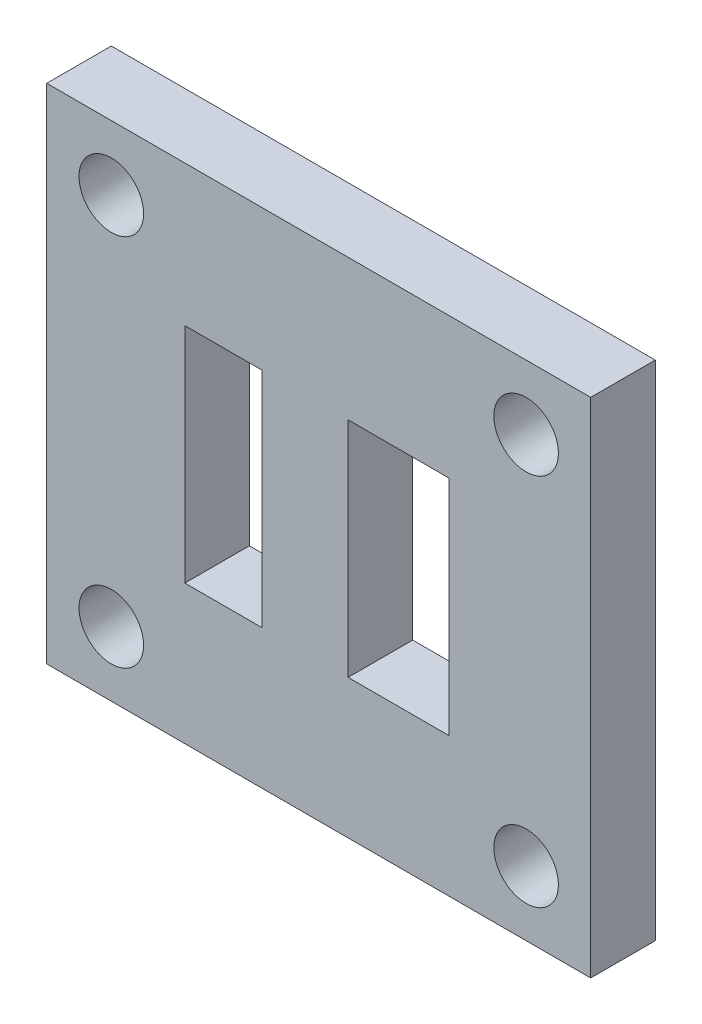
ISO-10303-21;
HEADER;
FILE_DESCRIPTION(('STEP AP214'),'2;1');
FILE_NAME('part.step','',(''),(''),'','','');
FILE_SCHEMA(('AUTOMOTIVE_DESIGN { 1 0 10303 214 1 1 1 1 }'));
ENDSEC;
DATA;
#1=APPLICATION_CONTEXT('core data for automotive mechanical design processes');
#2=APPLICATION_PROTOCOL_DEFINITION('international standard','automotive_design',2000,#1);
#3=PRODUCT_CONTEXT('',#1,'mechanical');
#4=PRODUCT('Part','Part','',(#3));
#5=PRODUCT_RELATED_PRODUCT_CATEGORY('part','',(#4));
#6=PRODUCT_DEFINITION_FORMATION('','',#4);
#7=PRODUCT_DEFINITION_CONTEXT('part definition',#1,'design');
#8=PRODUCT_DEFINITION('design','',#6,#7);
#9=PRODUCT_DEFINITION_SHAPE('','',#8);
#10=(LENGTH_UNIT() NAMED_UNIT(*) SI_UNIT(.MILLI.,.METRE.));
#11=(NAMED_UNIT(*) PLANE_ANGLE_UNIT() SI_UNIT($,.RADIAN.));
#12=(NAMED_UNIT(*) SI_UNIT($,.STERADIAN.) SOLID_ANGLE_UNIT());
#13=UNCERTAINTY_MEASURE_WITH_UNIT(LENGTH_MEASURE(1.E-05),#10,'distance_accuracy_value','');
#14=(GEOMETRIC_REPRESENTATION_CONTEXT(3) GLOBAL_UNCERTAINTY_ASSIGNED_CONTEXT((#13)) GLOBAL_UNIT_ASSIGNED_CONTEXT((#10,
#11,#12)) REPRESENTATION_CONTEXT('',''));
#15=CARTESIAN_POINT('',(0.,0.,0.));
#16=DIRECTION('',(0.,0.,1.));
#17=DIRECTION('',(1.,0.,0.));
#18=AXIS2_PLACEMENT_3D('',#15,#16,#17);
#19=CARTESIAN_POINT('',(12.635,0.,3.));
#20=DIRECTION('',(1.,0.,0.));
#21=DIRECTION('',(0.,1.,0.));
#22=AXIS2_PLACEMENT_3D('',#19,#20,#21);
#23=PLANE('',#22);
#24=DIRECTION('',(0.,-1.,0.));
#25=VECTOR('',#24,1.);
#26=CARTESIAN_POINT('',(12.635,0.,0.));
#27=LINE('',#26,#25);
#28=CARTESIAN_POINT('',(12.635,11.68,0.));
#29=VERTEX_POINT('',#28);
#30=CARTESIAN_POINT('',(12.635,-11.68,0.));
#31=VERTEX_POINT('',#30);
#32=EDGE_CURVE('E216',#29,#31,#27,.T.);
#33=ORIENTED_EDGE('',*,*,#32,.F.);
#34=DIRECTION('',(0.,0.,-1.));
#35=VECTOR('',#34,1.);
#36=CARTESIAN_POINT('',(12.635,11.68,3.));
#37=LINE('',#36,#35);
#38=CARTESIAN_POINT('',(12.635,11.68,3.));
#39=VERTEX_POINT('',#38);
#40=EDGE_CURVE('E11',#39,#29,#37,.T.);
#41=ORIENTED_EDGE('',*,*,#40,.F.);
#42=DIRECTION('',(0.,-1.,0.));
#43=VECTOR('',#42,1.);
#44=CARTESIAN_POINT('',(12.635,0.,3.));
#45=LINE('',#44,#43);
#46=CARTESIAN_POINT('',(12.635,-11.68,3.));
#47=VERTEX_POINT('',#46);
#48=EDGE_CURVE('E164',#39,#47,#45,.T.);
#49=ORIENTED_EDGE('',*,*,#48,.T.);
#50=DIRECTION('',(0.,0.,-1.));
#51=VECTOR('',#50,1.);
#52=CARTESIAN_POINT('',(12.635,-11.68,3.));
#53=LINE('',#52,#51);
#54=EDGE_CURVE('E112',#47,#31,#53,.T.);
#55=ORIENTED_EDGE('',*,*,#54,.T.);
#56=EDGE_LOOP('',(#33,#41,#49,#55));
#57=FACE_BOUND('',#56,.T.);
#58=ADVANCED_FACE('F45',(#57),#23,.T.);
#59=CARTESIAN_POINT('',(0.,11.68,3.));
#60=DIRECTION('',(0.,1.,0.));
#61=DIRECTION('',(0.,0.,1.));
#62=AXIS2_PLACEMENT_3D('',#59,#60,#61);
#63=PLANE('',#62);
#64=DIRECTION('',(1.,0.,0.));
#65=VECTOR('',#64,1.);
#66=CARTESIAN_POINT('',(0.,11.68,0.));
#67=LINE('',#66,#65);
#68=CARTESIAN_POINT('',(-12.635,11.68,0.));
#69=VERTEX_POINT('',#68);
#70=EDGE_CURVE('E152',#69,#29,#67,.T.);
#71=ORIENTED_EDGE('',*,*,#70,.F.);
#72=DIRECTION('',(0.,0.,-1.));
#73=VECTOR('',#72,1.);
#74=CARTESIAN_POINT('',(-12.635,11.68,3.));
#75=LINE('',#74,#73);
#76=CARTESIAN_POINT('',(-12.635,11.68,3.));
#77=VERTEX_POINT('',#76);
#78=EDGE_CURVE('E56',#77,#69,#75,.T.);
#79=ORIENTED_EDGE('',*,*,#78,.F.);
#80=DIRECTION('',(1.,0.,0.));
#81=VECTOR('',#80,1.);
#82=CARTESIAN_POINT('',(0.,11.68,3.));
#83=LINE('',#82,#81);
#84=EDGE_CURVE('E150',#77,#39,#83,.T.);
#85=ORIENTED_EDGE('',*,*,#84,.T.);
#86=ORIENTED_EDGE('',*,*,#40,.T.);
#87=EDGE_LOOP('',(#71,#79,#85,#86));
#88=FACE_BOUND('',#87,.T.);
#89=ADVANCED_FACE('F148',(#88),#63,.T.);
#90=CARTESIAN_POINT('',(-12.635,0.,3.));
#91=DIRECTION('',(1.,0.,0.));
#92=DIRECTION('',(0.,1.,0.));
#93=AXIS2_PLACEMENT_3D('',#90,#91,#92);
#94=PLANE('',#93);
#95=DIRECTION('',(0.,-1.,0.));
#96=VECTOR('',#95,1.);
#97=CARTESIAN_POINT('',(-12.635,0.,0.));
#98=LINE('',#97,#96);
#99=CARTESIAN_POINT('',(-12.635,-11.68,0.));
#100=VERTEX_POINT('',#99);
#101=EDGE_CURVE('E221',#69,#100,#98,.T.);
#102=ORIENTED_EDGE('',*,*,#101,.T.);
#103=DIRECTION('',(0.,0.,-1.));
#104=VECTOR('',#103,1.);
#105=CARTESIAN_POINT('',(-12.635,-11.68,3.));
#106=LINE('',#105,#104);
#107=CARTESIAN_POINT('',(-12.635,-11.68,3.));
#108=VERTEX_POINT('',#107);
#109=EDGE_CURVE('E156',#108,#100,#106,.T.);
#110=ORIENTED_EDGE('',*,*,#109,.F.);
#111=DIRECTION('',(0.,-1.,0.));
#112=VECTOR('',#111,1.);
#113=CARTESIAN_POINT('',(-12.635,0.,3.));
#114=LINE('',#113,#112);
#115=EDGE_CURVE('E159',#77,#108,#114,.T.);
#116=ORIENTED_EDGE('',*,*,#115,.F.);
#117=ORIENTED_EDGE('',*,*,#78,.T.);
#118=EDGE_LOOP('',(#102,#110,#116,#117));
#119=FACE_BOUND('',#118,.T.);
#120=ADVANCED_FACE('F160',(#119),#94,.F.);
#121=CARTESIAN_POINT('',(0.,5.14,3.));
#122=DIRECTION('',(0.,1.,0.));
#123=DIRECTION('',(0.,0.,1.));
#124=AXIS2_PLACEMENT_3D('',#121,#122,#123);
#125=PLANE('',#124);
#126=DIRECTION('',(1.,0.,0.));
#127=VECTOR('',#126,1.);
#128=CARTESIAN_POINT('',(0.,5.14,0.));
#129=LINE('',#128,#127);
#130=CARTESIAN_POINT('',(-6.22,5.14,0.));
#131=VERTEX_POINT('',#130);
#132=CARTESIAN_POINT('',(-2.635,5.14,0.));
#133=VERTEX_POINT('',#132);
#134=EDGE_CURVE('E183',#131,#133,#129,.T.);
#135=ORIENTED_EDGE('',*,*,#134,.T.);
#136=DIRECTION('',(0.,0.,-1.));
#137=VECTOR('',#136,1.);
#138=CARTESIAN_POINT('',(-2.635,5.14,3.));
#139=LINE('',#138,#137);
#140=CARTESIAN_POINT('',(-2.635,5.14,3.));
#141=VERTEX_POINT('',#140);
#142=EDGE_CURVE('E229',#141,#133,#139,.T.);
#143=ORIENTED_EDGE('',*,*,#142,.F.);
#144=DIRECTION('',(1.,0.,0.));
#145=VECTOR('',#144,1.);
#146=CARTESIAN_POINT('',(0.,5.14,3.));
#147=LINE('',#146,#145);
#148=CARTESIAN_POINT('',(-6.22,5.14,3.));
#149=VERTEX_POINT('',#148);
#150=EDGE_CURVE('E332',#149,#141,#147,.T.);
#151=ORIENTED_EDGE('',*,*,#150,.F.);
#152=DIRECTION('',(0.,0.,-1.));
#153=VECTOR('',#152,1.);
#154=CARTESIAN_POINT('',(-6.22,5.14,3.));
#155=LINE('',#154,#153);
#156=EDGE_CURVE('E232',#149,#131,#155,.T.);
#157=ORIENTED_EDGE('',*,*,#156,.T.);
#158=EDGE_LOOP('',(#135,#143,#151,#157));
#159=FACE_BOUND('',#158,.T.);
#160=ADVANCED_FACE('F282',(#159),#125,.F.);
#161=CARTESIAN_POINT('',(-2.635,0.,3.));
#162=DIRECTION('',(1.,0.,0.));
#163=DIRECTION('',(0.,1.,0.));
#164=AXIS2_PLACEMENT_3D('',#161,#162,#163);
#165=PLANE('',#164);
#166=DIRECTION('',(0.,-1.,0.));
#167=VECTOR('',#166,1.);
#168=CARTESIAN_POINT('',(-2.635,0.,0.));
#169=LINE('',#168,#167);
#170=CARTESIAN_POINT('',(-2.635,-5.22,0.));
#171=VERTEX_POINT('',#170);
#172=EDGE_CURVE('E192',#133,#171,#169,.T.);
#173=ORIENTED_EDGE('',*,*,#172,.T.);
#174=DIRECTION('',(0.,0.,-1.));
#175=VECTOR('',#174,1.);
#176=CARTESIAN_POINT('',(-2.635,-5.22,3.));
#177=LINE('',#176,#175);
#178=CARTESIAN_POINT('',(-2.635,-5.22,3.));
#179=VERTEX_POINT('',#178);
#180=EDGE_CURVE('E238',#179,#171,#177,.T.);
#181=ORIENTED_EDGE('',*,*,#180,.F.);
#182=DIRECTION('',(0.,-1.,0.));
#183=VECTOR('',#182,1.);
#184=CARTESIAN_POINT('',(-2.635,0.,3.));
#185=LINE('',#184,#183);
#186=EDGE_CURVE('E340',#141,#179,#185,.T.);
#187=ORIENTED_EDGE('',*,*,#186,.F.);
#188=ORIENTED_EDGE('',*,*,#142,.T.);
#189=EDGE_LOOP('',(#173,#181,#187,#188));
#190=FACE_BOUND('',#189,.T.);
#191=ADVANCED_FACE('F309',(#190),#165,.F.);
#192=CARTESIAN_POINT('',(0.,-5.22,3.));
#193=DIRECTION('',(0.,1.,0.));
#194=DIRECTION('',(-1.,0.,0.));
#195=AXIS2_PLACEMENT_3D('',#192,#193,#194);
#196=PLANE('',#195);
#197=DIRECTION('',(1.,0.,0.));
#198=VECTOR('',#197,1.);
#199=CARTESIAN_POINT('',(0.,-5.22,0.));
#200=LINE('',#199,#198);
#201=CARTESIAN_POINT('',(-6.22,-5.22,0.));
#202=VERTEX_POINT('',#201);
#203=EDGE_CURVE('E191',#202,#171,#200,.T.);
#204=ORIENTED_EDGE('',*,*,#203,.F.);
#205=DIRECTION('',(0.,0.,-1.));
#206=VECTOR('',#205,1.);
#207=CARTESIAN_POINT('',(-6.22,-5.22,3.));
#208=LINE('',#207,#206);
#209=CARTESIAN_POINT('',(-6.22,-5.22,3.));
#210=VERTEX_POINT('',#209);
#211=EDGE_CURVE('E235',#210,#202,#208,.T.);
#212=ORIENTED_EDGE('',*,*,#211,.F.);
#213=DIRECTION('',(1.,0.,0.));
#214=VECTOR('',#213,1.);
#215=CARTESIAN_POINT('',(0.,-5.22,3.));
#216=LINE('',#215,#214);
#217=EDGE_CURVE('E337',#210,#179,#216,.T.);
#218=ORIENTED_EDGE('',*,*,#217,.T.);
#219=ORIENTED_EDGE('',*,*,#180,.T.);
#220=EDGE_LOOP('',(#204,#212,#218,#219));
#221=FACE_BOUND('',#220,.T.);
#222=ADVANCED_FACE('F306',(#221),#196,.T.);
#223=CARTESIAN_POINT('',(1.365,0.,3.));
#224=DIRECTION('',(1.,0.,0.));
#225=DIRECTION('',(0.,1.,0.));
#226=AXIS2_PLACEMENT_3D('',#223,#224,#225);
#227=PLANE('',#226);
#228=DIRECTION('',(0.,-1.,0.));
#229=VECTOR('',#228,1.);
#230=CARTESIAN_POINT('',(1.365,0.,0.));
#231=LINE('',#230,#229);
#232=CARTESIAN_POINT('',(1.365,5.14,0.));
#233=VERTEX_POINT('',#232);
#234=CARTESIAN_POINT('',(1.365,-5.22,0.));
#235=VERTEX_POINT('',#234);
#236=EDGE_CURVE('E175',#233,#235,#231,.T.);
#237=ORIENTED_EDGE('',*,*,#236,.F.);
#238=DIRECTION('',(0.,0.,-1.));
#239=VECTOR('',#238,1.);
#240=CARTESIAN_POINT('',(1.365,5.14,3.));
#241=LINE('',#240,#239);
#242=CARTESIAN_POINT('',(1.365,5.14,3.));
#243=VERTEX_POINT('',#242);
#244=EDGE_CURVE('E49',#243,#233,#241,.T.);
#245=ORIENTED_EDGE('',*,*,#244,.F.);
#246=DIRECTION('',(0.,-1.,0.));
#247=VECTOR('',#246,1.);
#248=CARTESIAN_POINT('',(1.365,0.,3.));
#249=LINE('',#248,#247);
#250=CARTESIAN_POINT('',(1.365,-5.22,3.));
#251=VERTEX_POINT('',#250);
#252=EDGE_CURVE('E226',#243,#251,#249,.T.);
#253=ORIENTED_EDGE('',*,*,#252,.T.);
#254=DIRECTION('',(0.,0.,-1.));
#255=VECTOR('',#254,1.);
#256=CARTESIAN_POINT('',(1.365,-5.22,3.));
#257=LINE('',#256,#255);
#258=EDGE_CURVE('E174',#251,#235,#257,.T.);
#259=ORIENTED_EDGE('',*,*,#258,.T.);
#260=EDGE_LOOP('',(#237,#245,#253,#259));
#261=FACE_BOUND('',#260,.T.);
#262=ADVANCED_FACE('F47',(#261),#227,.T.);
#263=CARTESIAN_POINT('',(6.05,5.14,0.));
#264=VERTEX_POINT('',#263);
#265=EDGE_CURVE('E179',#233,#264,#129,.T.);
#266=ORIENTED_EDGE('',*,*,#265,.T.);
#267=DIRECTION('',(0.,0.,-1.));
#268=VECTOR('',#267,1.);
#269=CARTESIAN_POINT('',(6.05,5.14,3.));
#270=LINE('',#269,#268);
#271=CARTESIAN_POINT('',(6.05,5.14,3.));
#272=VERTEX_POINT('',#271);
#273=EDGE_CURVE('E248',#272,#264,#270,.T.);
#274=ORIENTED_EDGE('',*,*,#273,.F.);
#275=EDGE_CURVE('E259',#243,#272,#147,.T.);
#276=ORIENTED_EDGE('',*,*,#275,.F.);
#277=ORIENTED_EDGE('',*,*,#244,.T.);
#278=EDGE_LOOP('',(#266,#274,#276,#277));
#279=FACE_BOUND('',#278,.T.);
#280=ADVANCED_FACE('F258',(#279),#125,.F.);
#281=CARTESIAN_POINT('',(6.05,0.,3.));
#282=DIRECTION('',(1.,0.,0.));
#283=DIRECTION('',(0.,1.,0.));
#284=AXIS2_PLACEMENT_3D('',#281,#282,#283);
#285=PLANE('',#284);
#286=DIRECTION('',(0.,-1.,0.));
#287=VECTOR('',#286,1.);
#288=CARTESIAN_POINT('',(6.05,0.,0.));
#289=LINE('',#288,#287);
#290=CARTESIAN_POINT('',(6.05,-5.22,0.));
#291=VERTEX_POINT('',#290);
#292=EDGE_CURVE('E182',#264,#291,#289,.T.);
#293=ORIENTED_EDGE('',*,*,#292,.T.);
#294=DIRECTION('',(0.,0.,-1.));
#295=VECTOR('',#294,1.);
#296=CARTESIAN_POINT('',(6.05,-5.22,3.));
#297=LINE('',#296,#295);
#298=CARTESIAN_POINT('',(6.05,-5.22,3.));
#299=VERTEX_POINT('',#298);
#300=EDGE_CURVE('E246',#299,#291,#297,.T.);
#301=ORIENTED_EDGE('',*,*,#300,.F.);
#302=DIRECTION('',(0.,-1.,0.));
#303=VECTOR('',#302,1.);
#304=CARTESIAN_POINT('',(6.05,0.,3.));
#305=LINE('',#304,#303);
#306=EDGE_CURVE('E330',#272,#299,#305,.T.);
#307=ORIENTED_EDGE('',*,*,#306,.F.);
#308=ORIENTED_EDGE('',*,*,#273,.T.);
#309=EDGE_LOOP('',(#293,#301,#307,#308));
#310=FACE_BOUND('',#309,.T.);
#311=ADVANCED_FACE('F271',(#310),#285,.F.);
#312=CARTESIAN_POINT('',(9.635,8.68,3.));
#313=DIRECTION('',(0.,0.,-1.));
#314=DIRECTION('',(-1.,0.,0.));
#315=AXIS2_PLACEMENT_3D('',#312,#313,#314);
#316=CYLINDRICAL_SURFACE('',#315,1.5);
#317=CARTESIAN_POINT('',(9.635,8.68,3.));
#318=DIRECTION('',(0.,0.,1.));
#319=DIRECTION('',(1.,0.,0.));
#320=AXIS2_PLACEMENT_3D('',#317,#318,#319);
#321=CIRCLE('',#320,1.5);
#322=CARTESIAN_POINT('',(11.135,8.68,3.));
#323=VERTEX_POINT('',#322);
#324=EDGE_CURVE('E168',#323,#323,#321,.T.);
#325=ORIENTED_EDGE('',*,*,#324,.T.);
#326=EDGE_LOOP('',(#325));
#327=FACE_BOUND('',#326,.T.);
#328=CARTESIAN_POINT('',(9.635,8.68,0.));
#329=DIRECTION('',(0.,0.,1.));
#330=DIRECTION('',(1.,0.,0.));
#331=AXIS2_PLACEMENT_3D('',#328,#329,#330);
#332=CIRCLE('',#331,1.5);
#333=CARTESIAN_POINT('',(11.135,8.68,0.));
#334=VERTEX_POINT('',#333);
#335=EDGE_CURVE('E212',#334,#334,#332,.T.);
#336=ORIENTED_EDGE('',*,*,#335,.F.);
#337=EDGE_LOOP('',(#336));
#338=FACE_BOUND('',#337,.T.);
#339=ADVANCED_FACE('F273',(#327,#338),#316,.F.);
#340=CARTESIAN_POINT('',(9.635,-8.68,3.));
#341=DIRECTION('',(0.,0.,-1.));
#342=DIRECTION('',(-1.,0.,0.));
#343=AXIS2_PLACEMENT_3D('',#340,#341,#342);
#344=CYLINDRICAL_SURFACE('',#343,1.5);
#345=CARTESIAN_POINT('',(9.635,-8.68,3.));
#346=DIRECTION('',(0.,0.,1.));
#347=DIRECTION('',(1.,0.,0.));
#348=AXIS2_PLACEMENT_3D('',#345,#346,#347);
#349=CIRCLE('',#348,1.5);
#350=CARTESIAN_POINT('',(11.135,-8.68,3.));
#351=VERTEX_POINT('',#350);
#352=EDGE_CURVE('E356',#351,#351,#349,.T.);
#353=ORIENTED_EDGE('',*,*,#352,.T.);
#354=EDGE_LOOP('',(#353));
#355=FACE_BOUND('',#354,.T.);
#356=CARTESIAN_POINT('',(9.635,-8.68,0.));
#357=DIRECTION('',(0.,0.,1.));
#358=DIRECTION('',(1.,0.,0.));
#359=AXIS2_PLACEMENT_3D('',#356,#357,#358);
#360=CIRCLE('',#359,1.5);
#361=CARTESIAN_POINT('',(11.135,-8.68,0.));
#362=VERTEX_POINT('',#361);
#363=EDGE_CURVE('E208',#362,#362,#360,.T.);
#364=ORIENTED_EDGE('',*,*,#363,.F.);
#365=EDGE_LOOP('',(#364));
#366=FACE_BOUND('',#365,.T.);
#367=ADVANCED_FACE('F278',(#355,#366),#344,.F.);
#368=CARTESIAN_POINT('',(-9.635,-8.68,3.));
#369=DIRECTION('',(0.,0.,-1.));
#370=DIRECTION('',(-1.,0.,0.));
#371=AXIS2_PLACEMENT_3D('',#368,#369,#370);
#372=CYLINDRICAL_SURFACE('',#371,1.5);
#373=CARTESIAN_POINT('',(-9.635,-8.68,3.));
#374=DIRECTION('',(0.,0.,1.));
#375=DIRECTION('',(1.,0.,0.));
#376=AXIS2_PLACEMENT_3D('',#373,#374,#375);
#377=CIRCLE('',#376,1.5);
#378=CARTESIAN_POINT('',(-8.135,-8.68,3.));
#379=VERTEX_POINT('',#378);
#380=EDGE_CURVE('E352',#379,#379,#377,.T.);
#381=ORIENTED_EDGE('',*,*,#380,.T.);
#382=EDGE_LOOP('',(#381));
#383=FACE_BOUND('',#382,.T.);
#384=CARTESIAN_POINT('',(-9.635,-8.68,0.));
#385=DIRECTION('',(0.,0.,1.));
#386=DIRECTION('',(1.,0.,0.));
#387=AXIS2_PLACEMENT_3D('',#384,#385,#386);
#388=CIRCLE('',#387,1.5);
#389=CARTESIAN_POINT('',(-8.135,-8.68,0.));
#390=VERTEX_POINT('',#389);
#391=EDGE_CURVE('E204',#390,#390,#388,.T.);
#392=ORIENTED_EDGE('',*,*,#391,.F.);
#393=EDGE_LOOP('',(#392));
#394=FACE_BOUND('',#393,.T.);
#395=ADVANCED_FACE('F293',(#383,#394),#372,.F.);
#396=CARTESIAN_POINT('',(-9.63500000000001,8.68,3.));
#397=DIRECTION('',(0.,0.,-1.));
#398=DIRECTION('',(-1.,0.,0.));
#399=AXIS2_PLACEMENT_3D('',#396,#397,#398);
#400=CYLINDRICAL_SURFACE('',#399,1.5);
#401=CARTESIAN_POINT('',(-9.63500000000001,8.68,3.));
#402=DIRECTION('',(0.,0.,1.));
#403=DIRECTION('',(1.,0.,0.));
#404=AXIS2_PLACEMENT_3D('',#401,#402,#403);
#405=CIRCLE('',#404,1.5);
#406=CARTESIAN_POINT('',(-8.135,8.68,3.));
#407=VERTEX_POINT('',#406);
#408=EDGE_CURVE('E348',#407,#407,#405,.T.);
#409=ORIENTED_EDGE('',*,*,#408,.T.);
#410=EDGE_LOOP('',(#409));
#411=FACE_BOUND('',#410,.T.);
#412=CARTESIAN_POINT('',(-9.63500000000001,8.68,0.));
#413=DIRECTION('',(0.,0.,1.));
#414=DIRECTION('',(1.,0.,0.));
#415=AXIS2_PLACEMENT_3D('',#412,#413,#414);
#416=CIRCLE('',#415,1.5);
#417=CARTESIAN_POINT('',(-8.135,8.68,0.));
#418=VERTEX_POINT('',#417);
#419=EDGE_CURVE('E200',#418,#418,#416,.T.);
#420=ORIENTED_EDGE('',*,*,#419,.F.);
#421=EDGE_LOOP('',(#420));
#422=FACE_BOUND('',#421,.T.);
#423=ADVANCED_FACE('F297',(#411,#422),#400,.F.);
#424=CARTESIAN_POINT('',(-6.22,0.,3.));
#425=DIRECTION('',(1.,0.,0.));
#426=DIRECTION('',(0.,1.,0.));
#427=AXIS2_PLACEMENT_3D('',#424,#425,#426);
#428=PLANE('',#427);
#429=DIRECTION('',(0.,-1.,0.));
#430=VECTOR('',#429,1.);
#431=CARTESIAN_POINT('',(-6.22,0.,0.));
#432=LINE('',#431,#430);
#433=EDGE_CURVE('E196',#131,#202,#432,.T.);
#434=ORIENTED_EDGE('',*,*,#433,.F.);
#435=ORIENTED_EDGE('',*,*,#156,.F.);
#436=DIRECTION('',(0.,-1.,0.));
#437=VECTOR('',#436,1.);
#438=CARTESIAN_POINT('',(-6.22,0.,3.));
#439=LINE('',#438,#437);
#440=EDGE_CURVE('E345',#149,#210,#439,.T.);
#441=ORIENTED_EDGE('',*,*,#440,.T.);
#442=ORIENTED_EDGE('',*,*,#211,.T.);
#443=EDGE_LOOP('',(#434,#435,#441,#442));
#444=FACE_BOUND('',#443,.T.);
#445=ADVANCED_FACE('F301',(#444),#428,.T.);
#446=EDGE_CURVE('E187',#235,#291,#200,.T.);
#447=ORIENTED_EDGE('',*,*,#446,.F.);
#448=ORIENTED_EDGE('',*,*,#258,.F.);
#449=EDGE_CURVE('E269',#251,#299,#216,.T.);
#450=ORIENTED_EDGE('',*,*,#449,.T.);
#451=ORIENTED_EDGE('',*,*,#300,.T.);
#452=EDGE_LOOP('',(#447,#448,#450,#451));
#453=FACE_BOUND('',#452,.T.);
#454=ADVANCED_FACE('F268',(#453),#196,.T.);
#455=CARTESIAN_POINT('',(0.,-11.68,3.));
#456=DIRECTION('',(0.,1.,0.));
#457=DIRECTION('',(0.,0.,1.));
#458=AXIS2_PLACEMENT_3D('',#455,#456,#457);
#459=PLANE('',#458);
#460=DIRECTION('',(1.,0.,0.));
#461=VECTOR('',#460,1.);
#462=CARTESIAN_POINT('',(0.,-11.68,0.));
#463=LINE('',#462,#461);
#464=EDGE_CURVE('E105',#100,#31,#463,.T.);
#465=ORIENTED_EDGE('',*,*,#464,.T.);
#466=ORIENTED_EDGE('',*,*,#54,.F.);
#467=DIRECTION('',(1.,0.,0.));
#468=VECTOR('',#467,1.);
#469=CARTESIAN_POINT('',(0.,-11.68,3.));
#470=LINE('',#469,#468);
#471=EDGE_CURVE('E65',#108,#47,#470,.T.);
#472=ORIENTED_EDGE('',*,*,#471,.F.);
#473=ORIENTED_EDGE('',*,*,#109,.T.);
#474=EDGE_LOOP('',(#465,#466,#472,#473));
#475=FACE_BOUND('',#474,.T.);
#476=ADVANCED_FACE('F366',(#475),#459,.F.);
#477=CARTESIAN_POINT('',(0.,0.,3.));
#478=DIRECTION('',(0.,0.,1.));
#479=DIRECTION('',(1.,0.,0.));
#480=AXIS2_PLACEMENT_3D('',#477,#478,#479);
#481=PLANE('',#480);
#482=ORIENTED_EDGE('',*,*,#252,.F.);
#483=ORIENTED_EDGE('',*,*,#275,.T.);
#484=ORIENTED_EDGE('',*,*,#306,.T.);
#485=ORIENTED_EDGE('',*,*,#449,.F.);
#486=EDGE_LOOP('',(#482,#483,#484,#485));
#487=FACE_BOUND('',#486,.T.);
#488=ORIENTED_EDGE('',*,*,#150,.T.);
#489=ORIENTED_EDGE('',*,*,#186,.T.);
#490=ORIENTED_EDGE('',*,*,#217,.F.);
#491=ORIENTED_EDGE('',*,*,#440,.F.);
#492=EDGE_LOOP('',(#488,#489,#490,#491));
#493=FACE_BOUND('',#492,.T.);
#494=ORIENTED_EDGE('',*,*,#408,.F.);
#495=EDGE_LOOP('',(#494));
#496=FACE_BOUND('',#495,.T.);
#497=ORIENTED_EDGE('',*,*,#380,.F.);
#498=EDGE_LOOP('',(#497));
#499=FACE_BOUND('',#498,.T.);
#500=ORIENTED_EDGE('',*,*,#352,.F.);
#501=EDGE_LOOP('',(#500));
#502=FACE_BOUND('',#501,.T.);
#503=ORIENTED_EDGE('',*,*,#324,.F.);
#504=EDGE_LOOP('',(#503));
#505=FACE_BOUND('',#504,.T.);
#506=ORIENTED_EDGE('',*,*,#48,.F.);
#507=ORIENTED_EDGE('',*,*,#84,.F.);
#508=ORIENTED_EDGE('',*,*,#115,.T.);
#509=ORIENTED_EDGE('',*,*,#471,.T.);
#510=EDGE_LOOP('',(#506,#507,#508,#509));
#511=FACE_BOUND('',#510,.T.);
#512=ADVANCED_FACE('F163',(#487,#493,#496,#499,#502,#505,#511),#481,.T.);
#513=CARTESIAN_POINT('',(0.,0.,0.));
#514=DIRECTION('',(0.,0.,1.));
#515=DIRECTION('',(1.,0.,0.));
#516=AXIS2_PLACEMENT_3D('',#513,#514,#515);
#517=PLANE('',#516);
#518=ORIENTED_EDGE('',*,*,#236,.T.);
#519=ORIENTED_EDGE('',*,*,#446,.T.);
#520=ORIENTED_EDGE('',*,*,#292,.F.);
#521=ORIENTED_EDGE('',*,*,#265,.F.);
#522=EDGE_LOOP('',(#518,#519,#520,#521));
#523=FACE_BOUND('',#522,.T.);
#524=ORIENTED_EDGE('',*,*,#134,.F.);
#525=ORIENTED_EDGE('',*,*,#433,.T.);
#526=ORIENTED_EDGE('',*,*,#203,.T.);
#527=ORIENTED_EDGE('',*,*,#172,.F.);
#528=EDGE_LOOP('',(#524,#525,#526,#527));
#529=FACE_BOUND('',#528,.T.);
#530=ORIENTED_EDGE('',*,*,#419,.T.);
#531=EDGE_LOOP('',(#530));
#532=FACE_BOUND('',#531,.T.);
#533=ORIENTED_EDGE('',*,*,#391,.T.);
#534=EDGE_LOOP('',(#533));
#535=FACE_BOUND('',#534,.T.);
#536=ORIENTED_EDGE('',*,*,#363,.T.);
#537=EDGE_LOOP('',(#536));
#538=FACE_BOUND('',#537,.T.);
#539=ORIENTED_EDGE('',*,*,#335,.T.);
#540=EDGE_LOOP('',(#539));
#541=FACE_BOUND('',#540,.T.);
#542=ORIENTED_EDGE('',*,*,#32,.T.);
#543=ORIENTED_EDGE('',*,*,#464,.F.);
#544=ORIENTED_EDGE('',*,*,#101,.F.);
#545=ORIENTED_EDGE('',*,*,#70,.T.);
#546=EDGE_LOOP('',(#542,#543,#544,#545));
#547=FACE_BOUND('',#546,.T.);
#548=ADVANCED_FACE('F262',(#523,#529,#532,#535,#538,#541,#547),#517,.F.);
#549=CLOSED_SHELL('',(#58,#89,#120,#160,#191,#222,#262,#280,#311,#339,#367,#395,#423,#445,#454,
#476,#512,#548));
#550=MANIFOLD_SOLID_BREP('B2',#549);
#551=ADVANCED_BREP_SHAPE_REPRESENTATION('',(#18,#550),#14);
#552=SHAPE_DEFINITION_REPRESENTATION(#9,#551);
ENDSEC;
END-ISO-10303-21;
